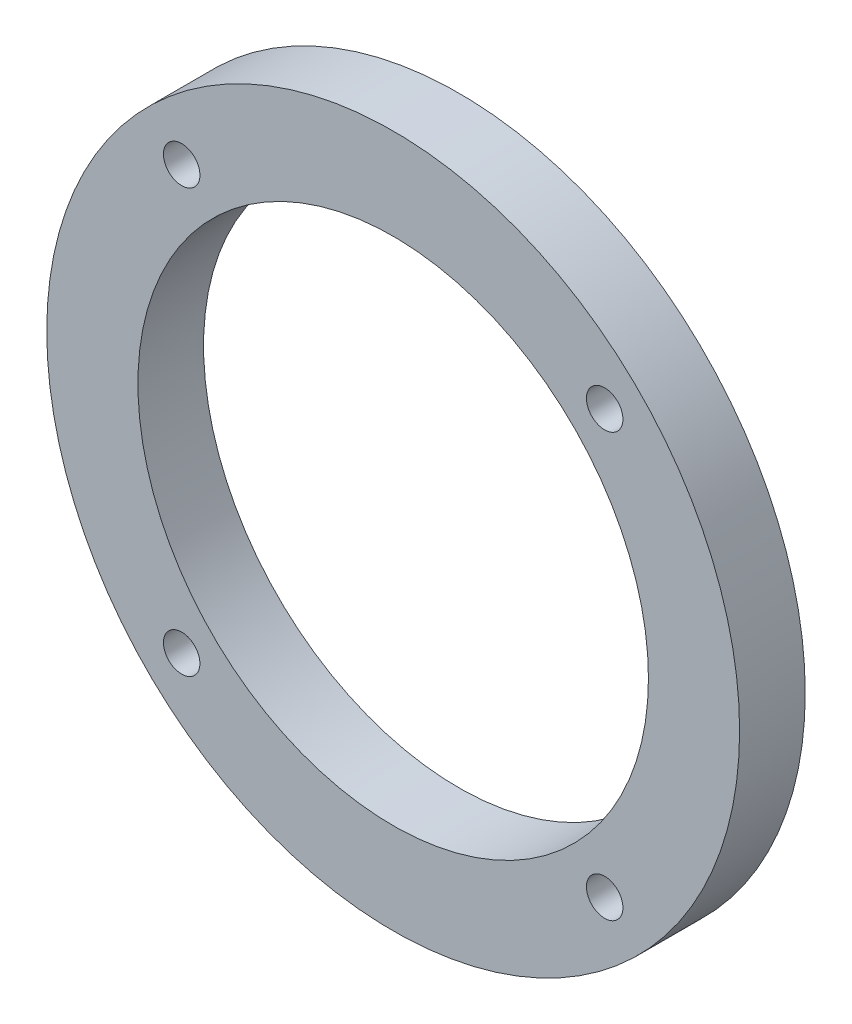
ISO-10303-21;
HEADER;
FILE_DESCRIPTION(('STEP AP214'),'2;1');
FILE_NAME('part.step','',(''),(''),'','','');
FILE_SCHEMA(('AUTOMOTIVE_DESIGN { 1 0 10303 214 1 1 1 1 }'));
ENDSEC;
DATA;
#1=APPLICATION_CONTEXT('core data for automotive mechanical design processes');
#2=APPLICATION_PROTOCOL_DEFINITION('international standard','automotive_design',2000,#1);
#3=PRODUCT_CONTEXT('',#1,'mechanical');
#4=PRODUCT('Part','Part','',(#3));
#5=PRODUCT_RELATED_PRODUCT_CATEGORY('part','',(#4));
#6=PRODUCT_DEFINITION_FORMATION('','',#4);
#7=PRODUCT_DEFINITION_CONTEXT('part definition',#1,'design');
#8=PRODUCT_DEFINITION('design','',#6,#7);
#9=PRODUCT_DEFINITION_SHAPE('','',#8);
#10=(LENGTH_UNIT() NAMED_UNIT(*) SI_UNIT(.MILLI.,.METRE.));
#11=(NAMED_UNIT(*) PLANE_ANGLE_UNIT() SI_UNIT($,.RADIAN.));
#12=(NAMED_UNIT(*) SI_UNIT($,.STERADIAN.) SOLID_ANGLE_UNIT());
#13=UNCERTAINTY_MEASURE_WITH_UNIT(LENGTH_MEASURE(1.E-05),#10,'distance_accuracy_value','');
#14=(GEOMETRIC_REPRESENTATION_CONTEXT(3) GLOBAL_UNCERTAINTY_ASSIGNED_CONTEXT((#13)) GLOBAL_UNIT_ASSIGNED_CONTEXT((#10,
#11,#12)) REPRESENTATION_CONTEXT('',''));
#15=CARTESIAN_POINT('',(0.,0.,0.));
#16=DIRECTION('',(0.,0.,1.));
#17=DIRECTION('',(1.,0.,0.));
#18=AXIS2_PLACEMENT_3D('',#15,#16,#17);
#19=CARTESIAN_POINT('',(0.,0.,9.));
#20=DIRECTION('',(0.,0.,1.));
#21=DIRECTION('',(1.,0.,0.));
#22=AXIS2_PLACEMENT_3D('',#19,#20,#21);
#23=PLANE('',#22);
#24=CARTESIAN_POINT('',(-29.,29.,9.));
#25=DIRECTION('',(0.,0.,1.));
#26=DIRECTION('',(1.,0.,0.));
#27=AXIS2_PLACEMENT_3D('',#24,#25,#26);
#28=CIRCLE('',#27,2.5);
#29=CARTESIAN_POINT('',(-26.5,29.,9.));
#30=VERTEX_POINT('',#29);
#31=EDGE_CURVE('E74',#30,#30,#28,.T.);
#32=ORIENTED_EDGE('',*,*,#31,.F.);
#33=EDGE_LOOP('',(#32));
#34=FACE_BOUND('',#33,.T.);
#35=CARTESIAN_POINT('',(-29.,-29.,9.));
#36=DIRECTION('',(0.,0.,1.));
#37=DIRECTION('',(1.,0.,0.));
#38=AXIS2_PLACEMENT_3D('',#35,#36,#37);
#39=CIRCLE('',#38,2.5);
#40=CARTESIAN_POINT('',(-26.5,-29.,9.));
#41=VERTEX_POINT('',#40);
#42=EDGE_CURVE('E77',#41,#41,#39,.T.);
#43=ORIENTED_EDGE('',*,*,#42,.F.);
#44=EDGE_LOOP('',(#43));
#45=FACE_BOUND('',#44,.T.);
#46=CARTESIAN_POINT('',(29.,-29.,9.));
#47=DIRECTION('',(0.,0.,1.));
#48=DIRECTION('',(1.,0.,0.));
#49=AXIS2_PLACEMENT_3D('',#46,#47,#48);
#50=CIRCLE('',#49,2.50000000000001);
#51=CARTESIAN_POINT('',(31.5,-29.,9.));
#52=VERTEX_POINT('',#51);
#53=EDGE_CURVE('E73',#52,#52,#50,.T.);
#54=ORIENTED_EDGE('',*,*,#53,.F.);
#55=EDGE_LOOP('',(#54));
#56=FACE_BOUND('',#55,.T.);
#57=CARTESIAN_POINT('',(29.,29.,9.));
#58=DIRECTION('',(0.,0.,1.));
#59=DIRECTION('',(1.,0.,0.));
#60=AXIS2_PLACEMENT_3D('',#57,#58,#59);
#61=CIRCLE('',#60,2.50000000000001);
#62=CARTESIAN_POINT('',(31.5,29.,9.));
#63=VERTEX_POINT('',#62);
#64=EDGE_CURVE('E55',#63,#63,#61,.T.);
#65=ORIENTED_EDGE('',*,*,#64,.F.);
#66=EDGE_LOOP('',(#65));
#67=FACE_BOUND('',#66,.T.);
#68=CARTESIAN_POINT('',(0.,0.,9.));
#69=DIRECTION('',(0.,0.,1.));
#70=DIRECTION('',(1.,0.,0.));
#71=AXIS2_PLACEMENT_3D('',#68,#69,#70);
#72=CIRCLE('',#71,47.5);
#73=CARTESIAN_POINT('',(47.5,0.,9.));
#74=VERTEX_POINT('',#73);
#75=EDGE_CURVE('E10',#74,#74,#72,.T.);
#76=ORIENTED_EDGE('',*,*,#75,.T.);
#77=EDGE_LOOP('',(#76));
#78=FACE_BOUND('',#77,.T.);
#79=CARTESIAN_POINT('',(0.,0.,9.));
#80=DIRECTION('',(0.,0.,1.));
#81=DIRECTION('',(1.,0.,0.));
#82=AXIS2_PLACEMENT_3D('',#79,#80,#81);
#83=CIRCLE('',#82,35.);
#84=CARTESIAN_POINT('',(35.,0.,9.));
#85=VERTEX_POINT('',#84);
#86=EDGE_CURVE('E45',#85,#85,#83,.T.);
#87=ORIENTED_EDGE('',*,*,#86,.F.);
#88=EDGE_LOOP('',(#87));
#89=FACE_BOUND('',#88,.T.);
#90=ADVANCED_FACE('F32',(#34,#45,#56,#67,#78,#89),#23,.T.);
#91=CARTESIAN_POINT('',(0.,0.,0.));
#92=DIRECTION('',(0.,0.,1.));
#93=DIRECTION('',(1.,0.,0.));
#94=AXIS2_PLACEMENT_3D('',#91,#92,#93);
#95=PLANE('',#94);
#96=CARTESIAN_POINT('',(-29.,29.,0.));
#97=DIRECTION('',(0.,0.,1.));
#98=DIRECTION('',(1.,0.,0.));
#99=AXIS2_PLACEMENT_3D('',#96,#97,#98);
#100=CIRCLE('',#99,2.5);
#101=CARTESIAN_POINT('',(-26.5,29.,0.));
#102=VERTEX_POINT('',#101);
#103=EDGE_CURVE('E36',#102,#102,#100,.T.);
#104=ORIENTED_EDGE('',*,*,#103,.T.);
#105=EDGE_LOOP('',(#104));
#106=FACE_BOUND('',#105,.T.);
#107=CARTESIAN_POINT('',(-29.,-29.,0.));
#108=DIRECTION('',(0.,0.,1.));
#109=DIRECTION('',(1.,0.,0.));
#110=AXIS2_PLACEMENT_3D('',#107,#108,#109);
#111=CIRCLE('',#110,2.5);
#112=CARTESIAN_POINT('',(-26.5,-29.,0.));
#113=VERTEX_POINT('',#112);
#114=EDGE_CURVE('E57',#113,#113,#111,.T.);
#115=ORIENTED_EDGE('',*,*,#114,.T.);
#116=EDGE_LOOP('',(#115));
#117=FACE_BOUND('',#116,.T.);
#118=CARTESIAN_POINT('',(29.,-29.,0.));
#119=DIRECTION('',(0.,0.,1.));
#120=DIRECTION('',(1.,0.,0.));
#121=AXIS2_PLACEMENT_3D('',#118,#119,#120);
#122=CIRCLE('',#121,2.50000000000001);
#123=CARTESIAN_POINT('',(31.5,-29.,0.));
#124=VERTEX_POINT('',#123);
#125=EDGE_CURVE('E54',#124,#124,#122,.T.);
#126=ORIENTED_EDGE('',*,*,#125,.T.);
#127=EDGE_LOOP('',(#126));
#128=FACE_BOUND('',#127,.T.);
#129=CARTESIAN_POINT('',(29.,29.,0.));
#130=DIRECTION('',(0.,0.,1.));
#131=DIRECTION('',(1.,0.,0.));
#132=AXIS2_PLACEMENT_3D('',#129,#130,#131);
#133=CIRCLE('',#132,2.50000000000001);
#134=CARTESIAN_POINT('',(31.5,29.,0.));
#135=VERTEX_POINT('',#134);
#136=EDGE_CURVE('E51',#135,#135,#133,.T.);
#137=ORIENTED_EDGE('',*,*,#136,.T.);
#138=EDGE_LOOP('',(#137));
#139=FACE_BOUND('',#138,.T.);
#140=CARTESIAN_POINT('',(0.,0.,0.));
#141=DIRECTION('',(0.,0.,1.));
#142=DIRECTION('',(1.,0.,0.));
#143=AXIS2_PLACEMENT_3D('',#140,#141,#142);
#144=CIRCLE('',#143,47.5);
#145=CARTESIAN_POINT('',(47.5,0.,0.));
#146=VERTEX_POINT('',#145);
#147=EDGE_CURVE('E40',#146,#146,#144,.T.);
#148=ORIENTED_EDGE('',*,*,#147,.F.);
#149=EDGE_LOOP('',(#148));
#150=FACE_BOUND('',#149,.T.);
#151=CARTESIAN_POINT('',(0.,0.,0.));
#152=DIRECTION('',(0.,0.,1.));
#153=DIRECTION('',(1.,0.,0.));
#154=AXIS2_PLACEMENT_3D('',#151,#152,#153);
#155=CIRCLE('',#154,35.);
#156=CARTESIAN_POINT('',(35.,0.,0.));
#157=VERTEX_POINT('',#156);
#158=EDGE_CURVE('E48',#157,#157,#155,.T.);
#159=ORIENTED_EDGE('',*,*,#158,.T.);
#160=EDGE_LOOP('',(#159));
#161=FACE_BOUND('',#160,.T.);
#162=ADVANCED_FACE('F88',(#106,#117,#128,#139,#150,#161),#95,.F.);
#163=CARTESIAN_POINT('',(0.,0.,9.));
#164=DIRECTION('',(0.,0.,-1.));
#165=DIRECTION('',(-1.,0.,0.));
#166=AXIS2_PLACEMENT_3D('',#163,#164,#165);
#167=CYLINDRICAL_SURFACE('',#166,47.5);
#168=ORIENTED_EDGE('',*,*,#75,.F.);
#169=EDGE_LOOP('',(#168));
#170=FACE_BOUND('',#169,.T.);
#171=ORIENTED_EDGE('',*,*,#147,.T.);
#172=EDGE_LOOP('',(#171));
#173=FACE_BOUND('',#172,.T.);
#174=ADVANCED_FACE('F34',(#170,#173),#167,.T.);
#175=CARTESIAN_POINT('',(0.,0.,9.));
#176=DIRECTION('',(0.,0.,-1.));
#177=DIRECTION('',(-1.,0.,0.));
#178=AXIS2_PLACEMENT_3D('',#175,#176,#177);
#179=CYLINDRICAL_SURFACE('',#178,35.);
#180=ORIENTED_EDGE('',*,*,#86,.T.);
#181=EDGE_LOOP('',(#180));
#182=FACE_BOUND('',#181,.T.);
#183=ORIENTED_EDGE('',*,*,#158,.F.);
#184=EDGE_LOOP('',(#183));
#185=FACE_BOUND('',#184,.T.);
#186=ADVANCED_FACE('F97',(#182,#185),#179,.F.);
#187=CARTESIAN_POINT('',(29.,29.,-1.));
#188=DIRECTION('',(0.,0.,1.));
#189=DIRECTION('',(1.,0.,0.));
#190=AXIS2_PLACEMENT_3D('',#187,#188,#189);
#191=CYLINDRICAL_SURFACE('',#190,2.50000000000001);
#192=ORIENTED_EDGE('',*,*,#64,.T.);
#193=EDGE_LOOP('',(#192));
#194=FACE_BOUND('',#193,.T.);
#195=ORIENTED_EDGE('',*,*,#136,.F.);
#196=EDGE_LOOP('',(#195));
#197=FACE_BOUND('',#196,.T.);
#198=ADVANCED_FACE('F94',(#194,#197),#191,.F.);
#199=CARTESIAN_POINT('',(29.,-29.,-1.));
#200=DIRECTION('',(0.,0.,1.));
#201=DIRECTION('',(1.,0.,0.));
#202=AXIS2_PLACEMENT_3D('',#199,#200,#201);
#203=CYLINDRICAL_SURFACE('',#202,2.50000000000001);
#204=ORIENTED_EDGE('',*,*,#53,.T.);
#205=EDGE_LOOP('',(#204));
#206=FACE_BOUND('',#205,.T.);
#207=ORIENTED_EDGE('',*,*,#125,.F.);
#208=EDGE_LOOP('',(#207));
#209=FACE_BOUND('',#208,.T.);
#210=ADVANCED_FACE('F83',(#206,#209),#203,.F.);
#211=CARTESIAN_POINT('',(-29.,-29.,-1.));
#212=DIRECTION('',(0.,0.,1.));
#213=DIRECTION('',(1.,0.,0.));
#214=AXIS2_PLACEMENT_3D('',#211,#212,#213);
#215=CYLINDRICAL_SURFACE('',#214,2.5);
#216=ORIENTED_EDGE('',*,*,#42,.T.);
#217=EDGE_LOOP('',(#216));
#218=FACE_BOUND('',#217,.T.);
#219=ORIENTED_EDGE('',*,*,#114,.F.);
#220=EDGE_LOOP('',(#219));
#221=FACE_BOUND('',#220,.T.);
#222=ADVANCED_FACE('F118',(#218,#221),#215,.F.);
#223=CARTESIAN_POINT('',(-29.,29.,-1.));
#224=DIRECTION('',(0.,0.,1.));
#225=DIRECTION('',(1.,0.,0.));
#226=AXIS2_PLACEMENT_3D('',#223,#224,#225);
#227=CYLINDRICAL_SURFACE('',#226,2.5);
#228=ORIENTED_EDGE('',*,*,#31,.T.);
#229=EDGE_LOOP('',(#228));
#230=FACE_BOUND('',#229,.T.);
#231=ORIENTED_EDGE('',*,*,#103,.F.);
#232=EDGE_LOOP('',(#231));
#233=FACE_BOUND('',#232,.T.);
#234=ADVANCED_FACE('F115',(#230,#233),#227,.F.);
#235=CLOSED_SHELL('',(#90,#162,#174,#186,#198,#210,#222,#234));
#236=MANIFOLD_SOLID_BREP('B2',#235);
#237=ADVANCED_BREP_SHAPE_REPRESENTATION('',(#18,#236),#14);
#238=SHAPE_DEFINITION_REPRESENTATION(#9,#237);
ENDSEC;
END-ISO-10303-21;
